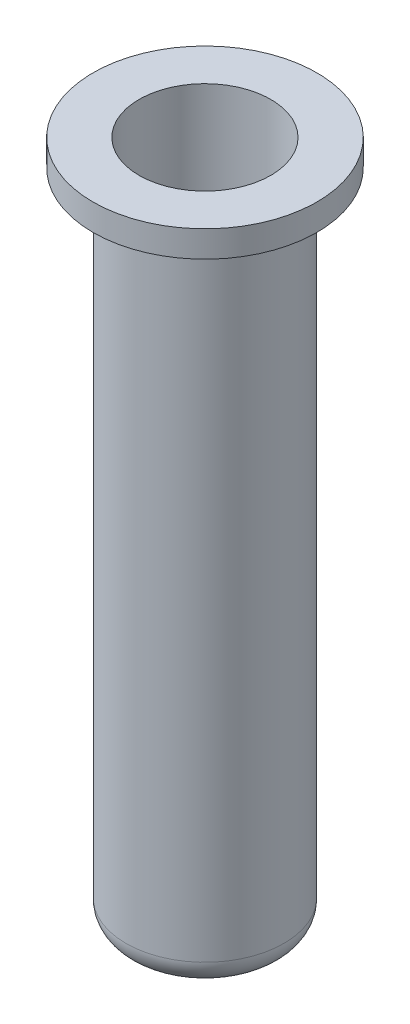
ISO-10303-21;
HEADER;
FILE_DESCRIPTION(('STEP AP214'),'2;1');
FILE_NAME('part.step','',(''),(''),'','','');
FILE_SCHEMA(('AUTOMOTIVE_DESIGN { 1 0 10303 214 1 1 1 1 }'));
ENDSEC;
DATA;
#1=APPLICATION_CONTEXT('core data for automotive mechanical design processes');
#2=APPLICATION_PROTOCOL_DEFINITION('international standard','automotive_design',2000,#1);
#3=PRODUCT_CONTEXT('',#1,'mechanical');
#4=PRODUCT('Part','Part','',(#3));
#5=PRODUCT_RELATED_PRODUCT_CATEGORY('part','',(#4));
#6=PRODUCT_DEFINITION_FORMATION('','',#4);
#7=PRODUCT_DEFINITION_CONTEXT('part definition',#1,'design');
#8=PRODUCT_DEFINITION('design','',#6,#7);
#9=PRODUCT_DEFINITION_SHAPE('','',#8);
#10=(LENGTH_UNIT() NAMED_UNIT(*) SI_UNIT(.MILLI.,.METRE.));
#11=(NAMED_UNIT(*) PLANE_ANGLE_UNIT() SI_UNIT($,.RADIAN.));
#12=(NAMED_UNIT(*) SI_UNIT($,.STERADIAN.) SOLID_ANGLE_UNIT());
#13=UNCERTAINTY_MEASURE_WITH_UNIT(LENGTH_MEASURE(1.E-05),#10,'distance_accuracy_value','');
#14=(GEOMETRIC_REPRESENTATION_CONTEXT(3) GLOBAL_UNCERTAINTY_ASSIGNED_CONTEXT((#13)) GLOBAL_UNIT_ASSIGNED_CONTEXT((#10,
#11,#12)) REPRESENTATION_CONTEXT('',''));
#15=CARTESIAN_POINT('',(0.,0.,0.));
#16=DIRECTION('',(0.,0.,1.));
#17=DIRECTION('',(1.,0.,0.));
#18=AXIS2_PLACEMENT_3D('',#15,#16,#17);
#19=CARTESIAN_POINT('',(0.,26.,0.));
#20=DIRECTION('',(0.,-1.,0.));
#21=DIRECTION('',(0.,0.,-1.));
#22=AXIS2_PLACEMENT_3D('',#19,#20,#21);
#23=CYLINDRICAL_SURFACE('',#22,3.);
#24=CARTESIAN_POINT('',(0.,1.,0.));
#25=DIRECTION('',(0.,1.,0.));
#26=DIRECTION('',(0.,0.,1.));
#27=AXIS2_PLACEMENT_3D('',#24,#25,#26);
#28=CIRCLE('',#27,3.);
#29=CARTESIAN_POINT('',(0.,1.,3.));
#30=VERTEX_POINT('',#29);
#31=EDGE_CURVE('E46',#30,#30,#28,.T.);
#32=ORIENTED_EDGE('',*,*,#31,.T.);
#33=EDGE_LOOP('',(#32));
#34=FACE_BOUND('',#33,.T.);
#35=CARTESIAN_POINT('',(0.,25.,0.));
#36=DIRECTION('',(0.,1.,0.));
#37=DIRECTION('',(0.,0.,1.));
#38=AXIS2_PLACEMENT_3D('',#35,#36,#37);
#39=CIRCLE('',#38,3.);
#40=CARTESIAN_POINT('',(0.,25.,3.));
#41=VERTEX_POINT('',#40);
#42=EDGE_CURVE('E10',#41,#41,#39,.T.);
#43=ORIENTED_EDGE('',*,*,#42,.F.);
#44=EDGE_LOOP('',(#43));
#45=FACE_BOUND('',#44,.T.);
#46=ADVANCED_FACE('F35',(#34,#45),#23,.T.);
#47=CARTESIAN_POINT('',(0.,0.,0.));
#48=DIRECTION('',(0.,1.,0.));
#49=DIRECTION('',(0.,0.,1.));
#50=AXIS2_PLACEMENT_3D('',#47,#48,#49);
#51=PLANE('',#50);
#52=CARTESIAN_POINT('',(0.,0.,0.));
#53=DIRECTION('',(0.,1.,0.));
#54=DIRECTION('',(0.,0.,1.));
#55=AXIS2_PLACEMENT_3D('',#52,#53,#54);
#56=CIRCLE('',#55,2.);
#57=CARTESIAN_POINT('',(0.,0.,2.));
#58=VERTEX_POINT('',#57);
#59=EDGE_CURVE('E42',#58,#58,#56,.F.);
#60=ORIENTED_EDGE('',*,*,#59,.T.);
#61=EDGE_LOOP('',(#60));
#62=FACE_BOUND('',#61,.T.);
#63=ADVANCED_FACE('F81',(#62),#51,.F.);
#64=CARTESIAN_POINT('',(0.,1.,0.));
#65=DIRECTION('',(0.,1.,0.));
#66=DIRECTION('',(0.,0.,1.));
#67=AXIS2_PLACEMENT_3D('',#64,#65,#66);
#68=TOROIDAL_SURFACE('',#67,2.,1.);
#69=ORIENTED_EDGE('',*,*,#59,.F.);
#70=EDGE_LOOP('',(#69));
#71=FACE_BOUND('',#70,.T.);
#72=ORIENTED_EDGE('',*,*,#31,.F.);
#73=EDGE_LOOP('',(#72));
#74=FACE_BOUND('',#73,.T.);
#75=ADVANCED_FACE('F37',(#71,#74),#68,.T.);
#76=CARTESIAN_POINT('',(0.,25.,0.));
#77=DIRECTION('',(0.,1.,0.));
#78=DIRECTION('',(0.,0.,1.));
#79=AXIS2_PLACEMENT_3D('',#76,#77,#78);
#80=CYLINDRICAL_SURFACE('',#79,4.25);
#81=CARTESIAN_POINT('',(0.,25.,0.));
#82=DIRECTION('',(0.,1.,0.));
#83=DIRECTION('',(0.,0.,1.));
#84=AXIS2_PLACEMENT_3D('',#81,#82,#83);
#85=CIRCLE('',#84,4.25);
#86=CARTESIAN_POINT('',(0.,25.,4.25));
#87=VERTEX_POINT('',#86);
#88=EDGE_CURVE('E56',#87,#87,#85,.T.);
#89=ORIENTED_EDGE('',*,*,#88,.T.);
#90=EDGE_LOOP('',(#89));
#91=FACE_BOUND('',#90,.T.);
#92=CARTESIAN_POINT('',(0.,26.,0.));
#93=DIRECTION('',(0.,1.,0.));
#94=DIRECTION('',(0.,0.,1.));
#95=AXIS2_PLACEMENT_3D('',#92,#93,#94);
#96=CIRCLE('',#95,4.25);
#97=CARTESIAN_POINT('',(0.,26.,4.25));
#98=VERTEX_POINT('',#97);
#99=EDGE_CURVE('E59',#98,#98,#96,.T.);
#100=ORIENTED_EDGE('',*,*,#99,.F.);
#101=EDGE_LOOP('',(#100));
#102=FACE_BOUND('',#101,.T.);
#103=ADVANCED_FACE('F65',(#91,#102),#80,.T.);
#104=CARTESIAN_POINT('',(0.,25.,0.));
#105=DIRECTION('',(0.,1.,0.));
#106=DIRECTION('',(0.,0.,1.));
#107=AXIS2_PLACEMENT_3D('',#104,#105,#106);
#108=PLANE('',#107);
#109=ORIENTED_EDGE('',*,*,#42,.T.);
#110=EDGE_LOOP('',(#109));
#111=FACE_BOUND('',#110,.T.);
#112=ORIENTED_EDGE('',*,*,#88,.F.);
#113=EDGE_LOOP('',(#112));
#114=FACE_BOUND('',#113,.T.);
#115=ADVANCED_FACE('F68',(#111,#114),#108,.F.);
#116=CARTESIAN_POINT('',(0.,12.,0.));
#117=DIRECTION('',(0.,1.,0.));
#118=DIRECTION('',(0.,0.,1.));
#119=AXIS2_PLACEMENT_3D('',#116,#117,#118);
#120=PLANE('',#119);
#121=CARTESIAN_POINT('',(0.,12.,0.));
#122=DIRECTION('',(0.,1.,0.));
#123=DIRECTION('',(0.,0.,1.));
#124=AXIS2_PLACEMENT_3D('',#121,#122,#123);
#125=CIRCLE('',#124,2.5);
#126=CARTESIAN_POINT('',(0.,12.,2.5));
#127=VERTEX_POINT('',#126);
#128=EDGE_CURVE('E50',#127,#127,#125,.T.);
#129=ORIENTED_EDGE('',*,*,#128,.T.);
#130=EDGE_LOOP('',(#129));
#131=FACE_BOUND('',#130,.T.);
#132=ADVANCED_FACE('F70',(#131),#120,.T.);
#133=CARTESIAN_POINT('',(0.,12.,0.));
#134=DIRECTION('',(0.,1.,0.));
#135=DIRECTION('',(0.,0.,1.));
#136=AXIS2_PLACEMENT_3D('',#133,#134,#135);
#137=CYLINDRICAL_SURFACE('',#136,2.5);
#138=ORIENTED_EDGE('',*,*,#128,.F.);
#139=EDGE_LOOP('',(#138));
#140=FACE_BOUND('',#139,.T.);
#141=CARTESIAN_POINT('',(0.,26.,0.));
#142=DIRECTION('',(0.,1.,0.));
#143=DIRECTION('',(0.,0.,1.));
#144=AXIS2_PLACEMENT_3D('',#141,#142,#143);
#145=CIRCLE('',#144,2.5);
#146=CARTESIAN_POINT('',(0.,26.,2.5));
#147=VERTEX_POINT('',#146);
#148=EDGE_CURVE('E53',#147,#147,#145,.T.);
#149=ORIENTED_EDGE('',*,*,#148,.T.);
#150=EDGE_LOOP('',(#149));
#151=FACE_BOUND('',#150,.T.);
#152=ADVANCED_FACE('F76',(#140,#151),#137,.F.);
#153=CARTESIAN_POINT('',(0.,26.,0.));
#154=DIRECTION('',(0.,1.,0.));
#155=DIRECTION('',(0.,0.,1.));
#156=AXIS2_PLACEMENT_3D('',#153,#154,#155);
#157=PLANE('',#156);
#158=ORIENTED_EDGE('',*,*,#148,.F.);
#159=EDGE_LOOP('',(#158));
#160=FACE_BOUND('',#159,.T.);
#161=ORIENTED_EDGE('',*,*,#99,.T.);
#162=EDGE_LOOP('',(#161));
#163=FACE_BOUND('',#162,.T.);
#164=ADVANCED_FACE('F89',(#160,#163),#157,.T.);
#165=CLOSED_SHELL('',(#46,#63,#75,#103,#115,#132,#152,#164));
#166=MANIFOLD_SOLID_BREP('B2',#165);
#167=ADVANCED_BREP_SHAPE_REPRESENTATION('',(#18,#166),#14);
#168=SHAPE_DEFINITION_REPRESENTATION(#9,#167);
ENDSEC;
END-ISO-10303-21;
